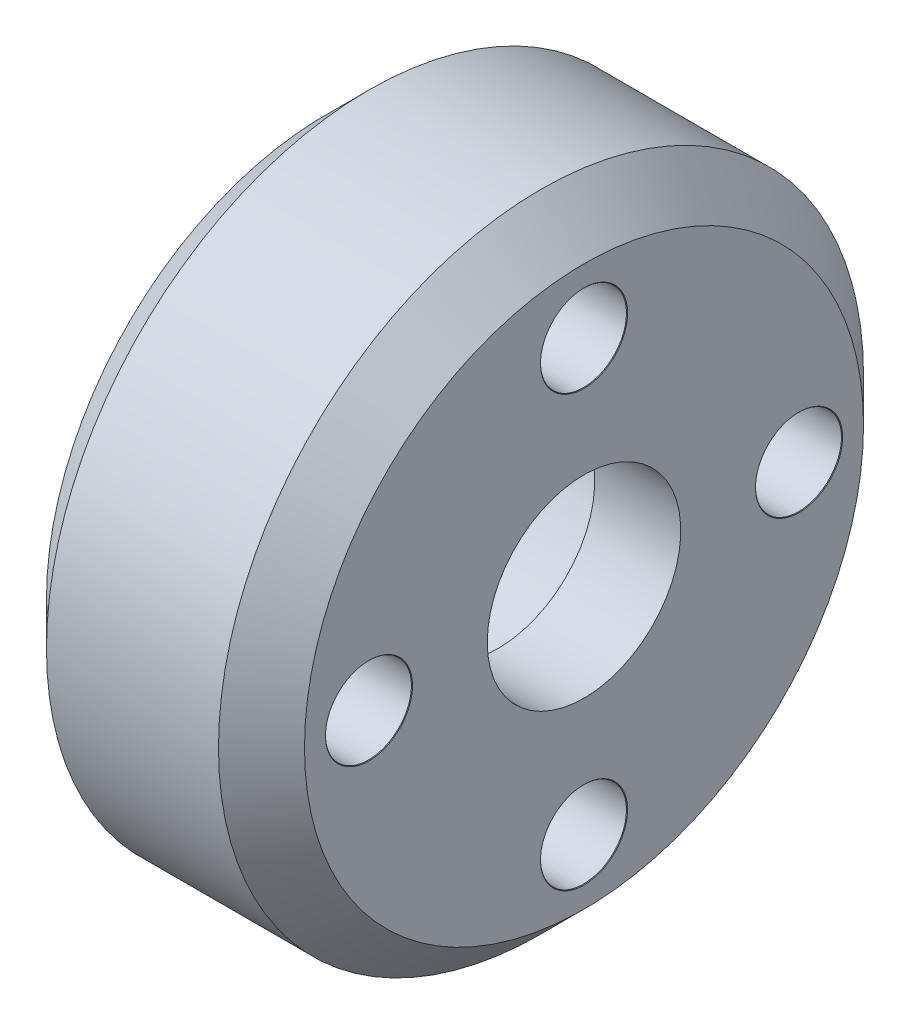
ISO-10303-21;
HEADER;
FILE_DESCRIPTION(('STEP AP214'),'2;1');
FILE_NAME('part.step','',(''),(''),'','','');
FILE_SCHEMA(('AUTOMOTIVE_DESIGN { 1 0 10303 214 1 1 1 1 }'));
ENDSEC;
DATA;
#1=APPLICATION_CONTEXT('core data for automotive mechanical design processes');
#2=APPLICATION_PROTOCOL_DEFINITION('international standard','automotive_design',2000,#1);
#3=PRODUCT_CONTEXT('',#1,'mechanical');
#4=PRODUCT('Part','Part','',(#3));
#5=PRODUCT_RELATED_PRODUCT_CATEGORY('part','',(#4));
#6=PRODUCT_DEFINITION_FORMATION('','',#4);
#7=PRODUCT_DEFINITION_CONTEXT('part definition',#1,'design');
#8=PRODUCT_DEFINITION('design','',#6,#7);
#9=PRODUCT_DEFINITION_SHAPE('','',#8);
#10=(LENGTH_UNIT() NAMED_UNIT(*) SI_UNIT(.MILLI.,.METRE.));
#11=(NAMED_UNIT(*) PLANE_ANGLE_UNIT() SI_UNIT($,.RADIAN.));
#12=(NAMED_UNIT(*) SI_UNIT($,.STERADIAN.) SOLID_ANGLE_UNIT());
#13=UNCERTAINTY_MEASURE_WITH_UNIT(LENGTH_MEASURE(1.E-05),#10,'distance_accuracy_value','');
#14=(GEOMETRIC_REPRESENTATION_CONTEXT(3) GLOBAL_UNCERTAINTY_ASSIGNED_CONTEXT((#13)) GLOBAL_UNIT_ASSIGNED_CONTEXT((#10,
#11,#12)) REPRESENTATION_CONTEXT('',''));
#15=CARTESIAN_POINT('',(0.,0.,0.));
#16=DIRECTION('',(0.,0.,1.));
#17=DIRECTION('',(1.,0.,0.));
#18=AXIS2_PLACEMENT_3D('',#15,#16,#17);
#19=CARTESIAN_POINT('',(0.,0.,0.));
#20=DIRECTION('',(-1.,0.,0.));
#21=DIRECTION('',(0.,0.,1.));
#22=AXIS2_PLACEMENT_3D('',#19,#20,#21);
#23=CYLINDRICAL_SURFACE('',#22,7.);
#24=CARTESIAN_POINT('',(8.,0.,0.));
#25=DIRECTION('',(-1.,0.,0.));
#26=DIRECTION('',(0.,0.,1.));
#27=AXIS2_PLACEMENT_3D('',#24,#25,#26);
#28=CIRCLE('',#27,7.);
#29=CARTESIAN_POINT('',(8.,0.,7.));
#30=VERTEX_POINT('',#29);
#31=EDGE_CURVE('E132',#30,#30,#28,.T.);
#32=ORIENTED_EDGE('',*,*,#31,.F.);
#33=EDGE_LOOP('',(#32));
#34=FACE_BOUND('',#33,.T.);
#35=CARTESIAN_POINT('',(0.,0.,0.));
#36=DIRECTION('',(-1.,0.,0.));
#37=DIRECTION('',(0.,0.,1.));
#38=AXIS2_PLACEMENT_3D('',#35,#36,#37);
#39=CIRCLE('',#38,7.);
#40=CARTESIAN_POINT('',(0.,0.,7.));
#41=VERTEX_POINT('',#40);
#42=EDGE_CURVE('E144',#41,#41,#39,.T.);
#43=ORIENTED_EDGE('',*,*,#42,.T.);
#44=EDGE_LOOP('',(#43));
#45=FACE_BOUND('',#44,.T.);
#46=ADVANCED_FACE('F54',(#34,#45),#23,.F.);
#47=CARTESIAN_POINT('',(0.,7.,0.));
#48=DIRECTION('',(1.,0.,0.));
#49=DIRECTION('',(0.,0.,-1.));
#50=AXIS2_PLACEMENT_3D('',#47,#48,#49);
#51=PLANE('',#50);
#52=CARTESIAN_POINT('',(0.,0.,0.));
#53=DIRECTION('',(1.,0.,0.));
#54=DIRECTION('',(0.,0.,-1.));
#55=AXIS2_PLACEMENT_3D('',#52,#53,#54);
#56=CIRCLE('',#55,13.);
#57=CARTESIAN_POINT('',(0.,0.,-13.));
#58=VERTEX_POINT('',#57);
#59=EDGE_CURVE('E148',#58,#58,#56,.F.);
#60=ORIENTED_EDGE('',*,*,#59,.T.);
#61=EDGE_LOOP('',(#60));
#62=FACE_BOUND('',#61,.T.);
#63=ORIENTED_EDGE('',*,*,#42,.F.);
#64=EDGE_LOOP('',(#63));
#65=FACE_BOUND('',#64,.T.);
#66=ADVANCED_FACE('F168',(#62,#65),#51,.F.);
#67=CARTESIAN_POINT('',(0.,0.,0.));
#68=DIRECTION('',(-1.,0.,0.));
#69=DIRECTION('',(0.,0.,1.));
#70=AXIS2_PLACEMENT_3D('',#67,#68,#69);
#71=CYLINDRICAL_SURFACE('',#70,15.);
#72=CARTESIAN_POINT('',(1.99999999999999,0.,0.));
#73=DIRECTION('',(1.,0.,0.));
#74=DIRECTION('',(0.,0.,-1.));
#75=AXIS2_PLACEMENT_3D('',#72,#73,#74);
#76=CIRCLE('',#75,15.);
#77=CARTESIAN_POINT('',(1.99999999999999,0.,-15.));
#78=VERTEX_POINT('',#77);
#79=EDGE_CURVE('E64',#78,#78,#76,.T.);
#80=ORIENTED_EDGE('',*,*,#79,.T.);
#81=EDGE_LOOP('',(#80));
#82=FACE_BOUND('',#81,.T.);
#83=CARTESIAN_POINT('',(9.99999999999999,0.,0.));
#84=DIRECTION('',(-1.,0.,0.));
#85=DIRECTION('',(0.,0.,1.));
#86=AXIS2_PLACEMENT_3D('',#83,#84,#85);
#87=CIRCLE('',#86,15.);
#88=CARTESIAN_POINT('',(9.99999999999999,0.,15.));
#89=VERTEX_POINT('',#88);
#90=EDGE_CURVE('E152',#89,#89,#87,.T.);
#91=ORIENTED_EDGE('',*,*,#90,.T.);
#92=EDGE_LOOP('',(#91));
#93=FACE_BOUND('',#92,.T.);
#94=ADVANCED_FACE('F159',(#82,#93),#71,.T.);
#95=CARTESIAN_POINT('',(12.,15.,0.));
#96=DIRECTION('',(-1.,0.,0.));
#97=DIRECTION('',(0.,0.,1.));
#98=AXIS2_PLACEMENT_3D('',#95,#96,#97);
#99=PLANE('',#98);
#100=CARTESIAN_POINT('',(12.,0.,0.));
#101=DIRECTION('',(-1.,0.,0.));
#102=DIRECTION('',(0.,0.,1.));
#103=AXIS2_PLACEMENT_3D('',#100,#101,#102);
#104=CIRCLE('',#103,13.);
#105=CARTESIAN_POINT('',(12.,0.,13.));
#106=VERTEX_POINT('',#105);
#107=EDGE_CURVE('E11',#106,#106,#104,.F.);
#108=ORIENTED_EDGE('',*,*,#107,.T.);
#109=EDGE_LOOP('',(#108));
#110=FACE_BOUND('',#109,.T.);
#111=CARTESIAN_POINT('',(12.,1.04744440165294E-13,10.));
#112=DIRECTION('',(1.,0.,0.));
#113=DIRECTION('',(0.,0.,-1.));
#114=AXIS2_PLACEMENT_3D('',#111,#112,#113);
#115=CIRCLE('',#114,2.025);
#116=CARTESIAN_POINT('',(12.,1.04744440165294E-13,7.975));
#117=VERTEX_POINT('',#116);
#118=EDGE_CURVE('E97',#117,#117,#115,.T.);
#119=ORIENTED_EDGE('',*,*,#118,.F.);
#120=EDGE_LOOP('',(#119));
#121=FACE_BOUND('',#120,.T.);
#122=CARTESIAN_POINT('',(12.,-10.,0.));
#123=DIRECTION('',(1.,0.,0.));
#124=DIRECTION('',(0.,0.,-1.));
#125=AXIS2_PLACEMENT_3D('',#122,#123,#124);
#126=CIRCLE('',#125,2.025);
#127=CARTESIAN_POINT('',(12.,-10.,-2.025));
#128=VERTEX_POINT('',#127);
#129=EDGE_CURVE('E88',#128,#128,#126,.T.);
#130=ORIENTED_EDGE('',*,*,#129,.F.);
#131=EDGE_LOOP('',(#130));
#132=FACE_BOUND('',#131,.T.);
#133=CARTESIAN_POINT('',(12.,0.,-10.));
#134=DIRECTION('',(1.,0.,0.));
#135=DIRECTION('',(0.,0.,-1.));
#136=AXIS2_PLACEMENT_3D('',#133,#134,#135);
#137=CIRCLE('',#136,2.025);
#138=CARTESIAN_POINT('',(12.,0.,-12.025));
#139=VERTEX_POINT('',#138);
#140=EDGE_CURVE('E108',#139,#139,#137,.T.);
#141=ORIENTED_EDGE('',*,*,#140,.F.);
#142=EDGE_LOOP('',(#141));
#143=FACE_BOUND('',#142,.T.);
#144=CARTESIAN_POINT('',(12.,10.,0.));
#145=DIRECTION('',(1.,0.,0.));
#146=DIRECTION('',(0.,0.,-1.));
#147=AXIS2_PLACEMENT_3D('',#144,#145,#146);
#148=CIRCLE('',#147,2.025);
#149=CARTESIAN_POINT('',(12.,10.,-2.025));
#150=VERTEX_POINT('',#149);
#151=EDGE_CURVE('E120',#150,#150,#148,.T.);
#152=ORIENTED_EDGE('',*,*,#151,.F.);
#153=EDGE_LOOP('',(#152));
#154=FACE_BOUND('',#153,.T.);
#155=CARTESIAN_POINT('',(12.,0.,0.));
#156=DIRECTION('',(-1.,0.,0.));
#157=DIRECTION('',(0.,0.,1.));
#158=AXIS2_PLACEMENT_3D('',#155,#156,#157);
#159=CIRCLE('',#158,4.5);
#160=CARTESIAN_POINT('',(12.,0.,4.5));
#161=VERTEX_POINT('',#160);
#162=EDGE_CURVE('E140',#161,#161,#159,.T.);
#163=ORIENTED_EDGE('',*,*,#162,.T.);
#164=EDGE_LOOP('',(#163));
#165=FACE_BOUND('',#164,.T.);
#166=ADVANCED_FACE('F189',(#110,#121,#132,#143,#154,#165),#99,.F.);
#167=CARTESIAN_POINT('',(0.,0.,0.));
#168=DIRECTION('',(-1.,0.,0.));
#169=DIRECTION('',(0.,0.,1.));
#170=AXIS2_PLACEMENT_3D('',#167,#168,#169);
#171=CYLINDRICAL_SURFACE('',#170,4.5);
#172=ORIENTED_EDGE('',*,*,#162,.F.);
#173=EDGE_LOOP('',(#172));
#174=FACE_BOUND('',#173,.T.);
#175=CARTESIAN_POINT('',(8.,0.,0.));
#176=DIRECTION('',(-1.,0.,0.));
#177=DIRECTION('',(0.,0.,1.));
#178=AXIS2_PLACEMENT_3D('',#175,#176,#177);
#179=CIRCLE('',#178,4.5);
#180=CARTESIAN_POINT('',(8.,0.,4.5));
#181=VERTEX_POINT('',#180);
#182=EDGE_CURVE('E136',#181,#181,#179,.T.);
#183=ORIENTED_EDGE('',*,*,#182,.T.);
#184=EDGE_LOOP('',(#183));
#185=FACE_BOUND('',#184,.T.);
#186=ADVANCED_FACE('F192',(#174,#185),#171,.F.);
#187=CARTESIAN_POINT('',(8.,7.,0.));
#188=DIRECTION('',(1.,0.,0.));
#189=DIRECTION('',(0.,0.,-1.));
#190=AXIS2_PLACEMENT_3D('',#187,#188,#189);
#191=PLANE('',#190);
#192=ORIENTED_EDGE('',*,*,#182,.F.);
#193=EDGE_LOOP('',(#192));
#194=FACE_BOUND('',#193,.T.);
#195=ORIENTED_EDGE('',*,*,#31,.T.);
#196=EDGE_LOOP('',(#195));
#197=FACE_BOUND('',#196,.T.);
#198=ADVANCED_FACE('F195',(#194,#197),#191,.F.);
#199=CARTESIAN_POINT('',(7.,10.,0.));
#200=DIRECTION('',(1.,0.,0.));
#201=DIRECTION('',(0.,0.,-1.));
#202=AXIS2_PLACEMENT_3D('',#199,#200,#201);
#203=CONICAL_SURFACE('',#202,2.,1.02974425867665);
#204=CARTESIAN_POINT('',(5.79827876194488,10.,0.));
#205=VERTEX_POINT('',#204);
#206=VERTEX_LOOP('',#205);
#207=FACE_BOUND('',#206,.T.);
#208=CARTESIAN_POINT('',(7.,10.,0.));
#209=DIRECTION('',(1.,0.,0.));
#210=DIRECTION('',(0.,0.,-1.));
#211=AXIS2_PLACEMENT_3D('',#208,#209,#210);
#212=CIRCLE('',#211,2.);
#213=CARTESIAN_POINT('',(7.,10.,-2.));
#214=VERTEX_POINT('',#213);
#215=EDGE_CURVE('E128',#214,#214,#212,.T.);
#216=ORIENTED_EDGE('',*,*,#215,.T.);
#217=EDGE_LOOP('',(#216));
#218=FACE_BOUND('',#217,.T.);
#219=ADVANCED_FACE('F199',(#207,#218),#203,.F.);
#220=CARTESIAN_POINT('',(12.,10.,0.));
#221=DIRECTION('',(1.,0.,0.));
#222=DIRECTION('',(0.,0.,-1.));
#223=AXIS2_PLACEMENT_3D('',#220,#221,#222);
#224=CYLINDRICAL_SURFACE('',#223,1.99999999999999);
#225=ORIENTED_EDGE('',*,*,#215,.F.);
#226=EDGE_LOOP('',(#225));
#227=FACE_BOUND('',#226,.T.);
#228=CARTESIAN_POINT('',(11.975,10.,0.));
#229=DIRECTION('',(1.,0.,0.));
#230=DIRECTION('',(0.,0.,-1.));
#231=AXIS2_PLACEMENT_3D('',#228,#229,#230);
#232=CIRCLE('',#231,1.99999999999999);
#233=CARTESIAN_POINT('',(11.975,10.,-1.99999999999999));
#234=VERTEX_POINT('',#233);
#235=EDGE_CURVE('E124',#234,#234,#232,.T.);
#236=ORIENTED_EDGE('',*,*,#235,.T.);
#237=EDGE_LOOP('',(#236));
#238=FACE_BOUND('',#237,.T.);
#239=ADVANCED_FACE('F203',(#227,#238),#224,.F.);
#240=CARTESIAN_POINT('',(12.,10.,0.));
#241=DIRECTION('',(1.,0.,0.));
#242=DIRECTION('',(0.,0.,-1.));
#243=AXIS2_PLACEMENT_3D('',#240,#241,#242);
#244=CONICAL_SURFACE('',#243,2.025,0.785398163397414);
#245=ORIENTED_EDGE('',*,*,#235,.F.);
#246=EDGE_LOOP('',(#245));
#247=FACE_BOUND('',#246,.T.);
#248=ORIENTED_EDGE('',*,*,#151,.T.);
#249=EDGE_LOOP('',(#248));
#250=FACE_BOUND('',#249,.T.);
#251=ADVANCED_FACE('F206',(#247,#250),#244,.F.);
#252=CARTESIAN_POINT('',(7.,0.,-10.));
#253=DIRECTION('',(1.,0.,0.));
#254=DIRECTION('',(0.,0.,-1.));
#255=AXIS2_PLACEMENT_3D('',#252,#253,#254);
#256=CONICAL_SURFACE('',#255,2.,1.02974425867665);
#257=CARTESIAN_POINT('',(5.79827876194488,0.,-10.));
#258=VERTEX_POINT('',#257);
#259=VERTEX_LOOP('',#258);
#260=FACE_BOUND('',#259,.T.);
#261=CARTESIAN_POINT('',(7.,0.,-10.));
#262=DIRECTION('',(1.,0.,0.));
#263=DIRECTION('',(0.,0.,-1.));
#264=AXIS2_PLACEMENT_3D('',#261,#262,#263);
#265=CIRCLE('',#264,2.);
#266=CARTESIAN_POINT('',(7.,0.,-12.));
#267=VERTEX_POINT('',#266);
#268=EDGE_CURVE('E116',#267,#267,#265,.T.);
#269=ORIENTED_EDGE('',*,*,#268,.T.);
#270=EDGE_LOOP('',(#269));
#271=FACE_BOUND('',#270,.T.);
#272=ADVANCED_FACE('F210',(#260,#271),#256,.F.);
#273=CARTESIAN_POINT('',(12.,0.,-10.));
#274=DIRECTION('',(1.,0.,0.));
#275=DIRECTION('',(0.,0.,-1.));
#276=AXIS2_PLACEMENT_3D('',#273,#274,#275);
#277=CYLINDRICAL_SURFACE('',#276,1.99999999999999);
#278=ORIENTED_EDGE('',*,*,#268,.F.);
#279=EDGE_LOOP('',(#278));
#280=FACE_BOUND('',#279,.T.);
#281=CARTESIAN_POINT('',(11.975,0.,-10.));
#282=DIRECTION('',(1.,0.,0.));
#283=DIRECTION('',(0.,0.,-1.));
#284=AXIS2_PLACEMENT_3D('',#281,#282,#283);
#285=CIRCLE('',#284,1.99999999999999);
#286=CARTESIAN_POINT('',(11.975,0.,-12.));
#287=VERTEX_POINT('',#286);
#288=EDGE_CURVE('E112',#287,#287,#285,.T.);
#289=ORIENTED_EDGE('',*,*,#288,.T.);
#290=EDGE_LOOP('',(#289));
#291=FACE_BOUND('',#290,.T.);
#292=ADVANCED_FACE('F214',(#280,#291),#277,.F.);
#293=CARTESIAN_POINT('',(12.,0.,-10.));
#294=DIRECTION('',(1.,0.,0.));
#295=DIRECTION('',(0.,0.,-1.));
#296=AXIS2_PLACEMENT_3D('',#293,#294,#295);
#297=CONICAL_SURFACE('',#296,2.025,0.785398163397405);
#298=ORIENTED_EDGE('',*,*,#288,.F.);
#299=EDGE_LOOP('',(#298));
#300=FACE_BOUND('',#299,.T.);
#301=ORIENTED_EDGE('',*,*,#140,.T.);
#302=EDGE_LOOP('',(#301));
#303=FACE_BOUND('',#302,.T.);
#304=ADVANCED_FACE('F217',(#300,#303),#297,.F.);
#305=CARTESIAN_POINT('',(7.,-10.,0.));
#306=DIRECTION('',(1.,0.,0.));
#307=DIRECTION('',(0.,0.,-1.));
#308=AXIS2_PLACEMENT_3D('',#305,#306,#307);
#309=CONICAL_SURFACE('',#308,2.,1.02974425867665);
#310=CARTESIAN_POINT('',(5.79827876194488,-10.,0.));
#311=VERTEX_POINT('',#310);
#312=VERTEX_LOOP('',#311);
#313=FACE_BOUND('',#312,.T.);
#314=CARTESIAN_POINT('',(7.,-10.,0.));
#315=DIRECTION('',(1.,0.,0.));
#316=DIRECTION('',(0.,0.,-1.));
#317=AXIS2_PLACEMENT_3D('',#314,#315,#316);
#318=CIRCLE('',#317,2.);
#319=CARTESIAN_POINT('',(7.,-10.,-2.));
#320=VERTEX_POINT('',#319);
#321=EDGE_CURVE('E104',#320,#320,#318,.T.);
#322=ORIENTED_EDGE('',*,*,#321,.T.);
#323=EDGE_LOOP('',(#322));
#324=FACE_BOUND('',#323,.T.);
#325=ADVANCED_FACE('F221',(#313,#324),#309,.F.);
#326=CARTESIAN_POINT('',(12.,-10.,0.));
#327=DIRECTION('',(1.,0.,0.));
#328=DIRECTION('',(0.,0.,-1.));
#329=AXIS2_PLACEMENT_3D('',#326,#327,#328);
#330=CYLINDRICAL_SURFACE('',#329,1.99999999999999);
#331=ORIENTED_EDGE('',*,*,#321,.F.);
#332=EDGE_LOOP('',(#331));
#333=FACE_BOUND('',#332,.T.);
#334=CARTESIAN_POINT('',(11.975,-10.,0.));
#335=DIRECTION('',(1.,0.,0.));
#336=DIRECTION('',(0.,0.,-1.));
#337=AXIS2_PLACEMENT_3D('',#334,#335,#336);
#338=CIRCLE('',#337,1.99999999999999);
#339=CARTESIAN_POINT('',(11.975,-10.,-1.99999999999999));
#340=VERTEX_POINT('',#339);
#341=EDGE_CURVE('E94',#340,#340,#338,.T.);
#342=ORIENTED_EDGE('',*,*,#341,.T.);
#343=EDGE_LOOP('',(#342));
#344=FACE_BOUND('',#343,.T.);
#345=ADVANCED_FACE('F225',(#333,#344),#330,.F.);
#346=CARTESIAN_POINT('',(12.,-10.,0.));
#347=DIRECTION('',(1.,0.,0.));
#348=DIRECTION('',(0.,0.,-1.));
#349=AXIS2_PLACEMENT_3D('',#346,#347,#348);
#350=CONICAL_SURFACE('',#349,2.025,0.785398163397414);
#351=ORIENTED_EDGE('',*,*,#341,.F.);
#352=EDGE_LOOP('',(#351));
#353=FACE_BOUND('',#352,.T.);
#354=ORIENTED_EDGE('',*,*,#129,.T.);
#355=EDGE_LOOP('',(#354));
#356=FACE_BOUND('',#355,.T.);
#357=ADVANCED_FACE('F81',(#353,#356),#350,.F.);
#358=CARTESIAN_POINT('',(7.,1.04744440165294E-13,10.));
#359=DIRECTION('',(1.,0.,0.));
#360=DIRECTION('',(0.,0.,-1.));
#361=AXIS2_PLACEMENT_3D('',#358,#359,#360);
#362=CONICAL_SURFACE('',#361,2.,1.02974425867665);
#363=CARTESIAN_POINT('',(5.79827876194488,1.03225456552616E-13,10.));
#364=VERTEX_POINT('',#363);
#365=VERTEX_LOOP('',#364);
#366=FACE_BOUND('',#365,.T.);
#367=CARTESIAN_POINT('',(7.,1.04744440165294E-13,10.));
#368=DIRECTION('',(1.,0.,0.));
#369=DIRECTION('',(0.,0.,-1.));
#370=AXIS2_PLACEMENT_3D('',#367,#368,#369);
#371=CIRCLE('',#370,2.);
#372=CARTESIAN_POINT('',(7.,1.04744440165294E-13,8.));
#373=VERTEX_POINT('',#372);
#374=EDGE_CURVE('E85',#373,#373,#371,.T.);
#375=ORIENTED_EDGE('',*,*,#374,.T.);
#376=EDGE_LOOP('',(#375));
#377=FACE_BOUND('',#376,.T.);
#378=ADVANCED_FACE('F77',(#366,#377),#362,.F.);
#379=CARTESIAN_POINT('',(12.,1.04744440165294E-13,10.));
#380=DIRECTION('',(1.,0.,0.));
#381=DIRECTION('',(0.,0.,-1.));
#382=AXIS2_PLACEMENT_3D('',#379,#380,#381);
#383=CYLINDRICAL_SURFACE('',#382,1.99999999999999);
#384=ORIENTED_EDGE('',*,*,#374,.F.);
#385=EDGE_LOOP('',(#384));
#386=FACE_BOUND('',#385,.T.);
#387=CARTESIAN_POINT('',(11.975,1.04744440165294E-13,10.));
#388=DIRECTION('',(1.,0.,0.));
#389=DIRECTION('',(0.,0.,-1.));
#390=AXIS2_PLACEMENT_3D('',#387,#388,#389);
#391=CIRCLE('',#390,1.99999999999999);
#392=CARTESIAN_POINT('',(11.975,1.04744440165294E-13,8.00000000000001));
#393=VERTEX_POINT('',#392);
#394=EDGE_CURVE('E89',#393,#393,#391,.T.);
#395=ORIENTED_EDGE('',*,*,#394,.T.);
#396=EDGE_LOOP('',(#395));
#397=FACE_BOUND('',#396,.T.);
#398=ADVANCED_FACE('F80',(#386,#397),#383,.F.);
#399=CARTESIAN_POINT('',(12.,1.04744440165294E-13,10.));
#400=DIRECTION('',(1.,0.,0.));
#401=DIRECTION('',(0.,0.,-1.));
#402=AXIS2_PLACEMENT_3D('',#399,#400,#401);
#403=CONICAL_SURFACE('',#402,2.025,0.785398163397405);
#404=ORIENTED_EDGE('',*,*,#394,.F.);
#405=EDGE_LOOP('',(#404));
#406=FACE_BOUND('',#405,.T.);
#407=ORIENTED_EDGE('',*,*,#118,.T.);
#408=EDGE_LOOP('',(#407));
#409=FACE_BOUND('',#408,.T.);
#410=ADVANCED_FACE('F165',(#406,#409),#403,.F.);
#411=CARTESIAN_POINT('',(0.,0.,0.));
#412=DIRECTION('',(1.,0.,0.));
#413=DIRECTION('',(0.,0.,-1.));
#414=AXIS2_PLACEMENT_3D('',#411,#412,#413);
#415=CONICAL_SURFACE('',#414,13.,0.78539816339745);
#416=ORIENTED_EDGE('',*,*,#79,.F.);
#417=EDGE_LOOP('',(#416));
#418=FACE_BOUND('',#417,.T.);
#419=ORIENTED_EDGE('',*,*,#59,.F.);
#420=EDGE_LOOP('',(#419));
#421=FACE_BOUND('',#420,.T.);
#422=ADVANCED_FACE('F162',(#418,#421),#415,.T.);
#423=CARTESIAN_POINT('',(9.99999999999999,0.,0.));
#424=DIRECTION('',(-1.,0.,0.));
#425=DIRECTION('',(0.,0.,1.));
#426=AXIS2_PLACEMENT_3D('',#423,#424,#425);
#427=CONICAL_SURFACE('',#426,15.,0.785398163397446);
#428=ORIENTED_EDGE('',*,*,#107,.F.);
#429=EDGE_LOOP('',(#428));
#430=FACE_BOUND('',#429,.T.);
#431=ORIENTED_EDGE('',*,*,#90,.F.);
#432=EDGE_LOOP('',(#431));
#433=FACE_BOUND('',#432,.T.);
#434=ADVANCED_FACE('F57',(#430,#433),#427,.T.);
#435=CLOSED_SHELL('',(#46,#66,#94,#166,#186,#198,#219,#239,#251,#272,#292,#304,#325,#345,#357,
#378,#398,#410,#422,#434));
#436=MANIFOLD_SOLID_BREP('B2',#435);
#437=ADVANCED_BREP_SHAPE_REPRESENTATION('',(#18,#436),#14);
#438=SHAPE_DEFINITION_REPRESENTATION(#9,#437);
ENDSEC;
END-ISO-10303-21;
